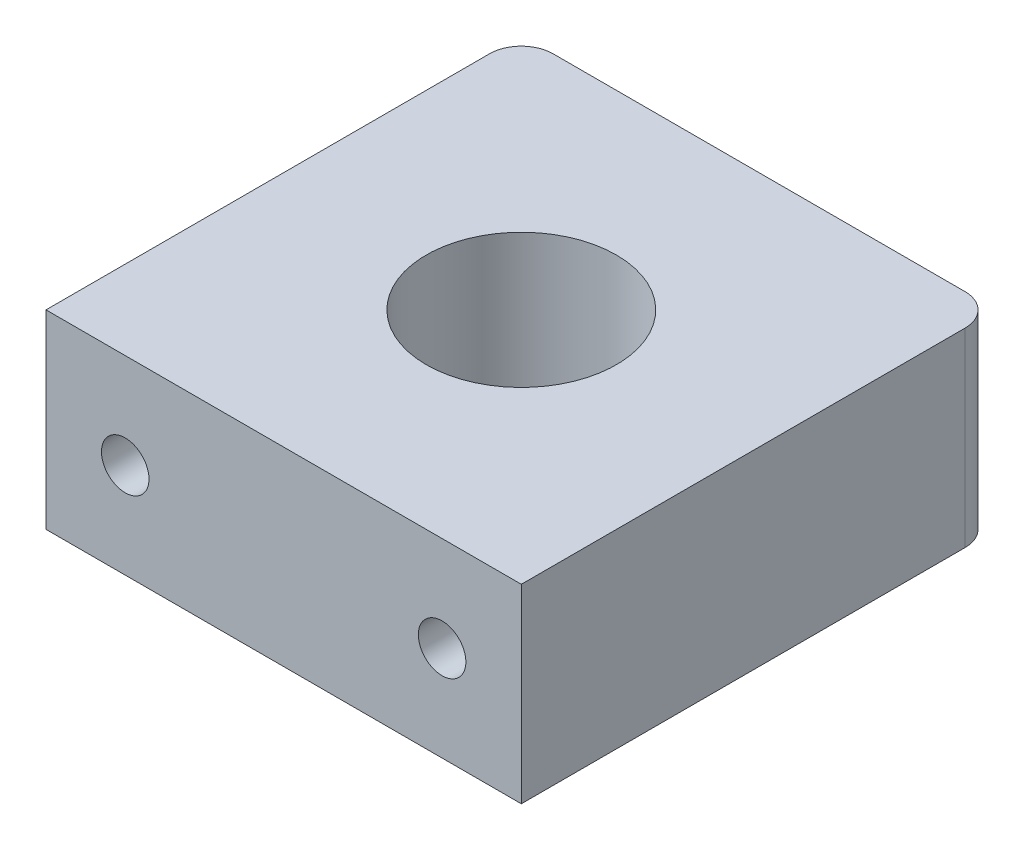
ISO-10303-21;
HEADER;
FILE_DESCRIPTION(('STEP AP214'),'2;1');
FILE_NAME('part.step','',(''),(''),'','','');
FILE_SCHEMA(('AUTOMOTIVE_DESIGN { 1 0 10303 214 1 1 1 1 }'));
ENDSEC;
DATA;
#1=APPLICATION_CONTEXT('core data for automotive mechanical design processes');
#2=APPLICATION_PROTOCOL_DEFINITION('international standard','automotive_design',2000,#1);
#3=PRODUCT_CONTEXT('',#1,'mechanical');
#4=PRODUCT('Part','Part','',(#3));
#5=PRODUCT_RELATED_PRODUCT_CATEGORY('part','',(#4));
#6=PRODUCT_DEFINITION_FORMATION('','',#4);
#7=PRODUCT_DEFINITION_CONTEXT('part definition',#1,'design');
#8=PRODUCT_DEFINITION('design','',#6,#7);
#9=PRODUCT_DEFINITION_SHAPE('','',#8);
#10=(LENGTH_UNIT() NAMED_UNIT(*) SI_UNIT(.MILLI.,.METRE.));
#11=(NAMED_UNIT(*) PLANE_ANGLE_UNIT() SI_UNIT($,.RADIAN.));
#12=(NAMED_UNIT(*) SI_UNIT($,.STERADIAN.) SOLID_ANGLE_UNIT());
#13=UNCERTAINTY_MEASURE_WITH_UNIT(LENGTH_MEASURE(1.E-05),#10,'distance_accuracy_value','');
#14=(GEOMETRIC_REPRESENTATION_CONTEXT(3) GLOBAL_UNCERTAINTY_ASSIGNED_CONTEXT((#13)) GLOBAL_UNIT_ASSIGNED_CONTEXT((#10,
#11,#12)) REPRESENTATION_CONTEXT('',''));
#15=CARTESIAN_POINT('',(0.,0.,0.));
#16=DIRECTION('',(0.,0.,1.));
#17=DIRECTION('',(1.,0.,0.));
#18=AXIS2_PLACEMENT_3D('',#15,#16,#17);
#19=CARTESIAN_POINT('',(0.,12.,0.));
#20=DIRECTION('',(0.,-1.,0.));
#21=DIRECTION('',(0.,0.,-1.));
#22=AXIS2_PLACEMENT_3D('',#19,#20,#21);
#23=PLANE('',#22);
#24=DIRECTION('',(0.,0.,-1.));
#25=VECTOR('',#24,1.);
#26=CARTESIAN_POINT('',(30.,12.,0.));
#27=LINE('',#26,#25);
#28=CARTESIAN_POINT('',(30.,12.,0.));
#29=VERTEX_POINT('',#28);
#30=CARTESIAN_POINT('',(30.,12.,-28.));
#31=VERTEX_POINT('',#30);
#32=EDGE_CURVE('E110',#29,#31,#27,.T.);
#33=ORIENTED_EDGE('',*,*,#32,.T.);
#34=CARTESIAN_POINT('',(28.,12.,-28.));
#35=DIRECTION('',(0.,-1.,0.));
#36=DIRECTION('',(0.,0.,-1.));
#37=AXIS2_PLACEMENT_3D('',#34,#35,#36);
#38=CIRCLE('',#37,2.);
#39=CARTESIAN_POINT('',(28.,12.,-30.));
#40=VERTEX_POINT('',#39);
#41=EDGE_CURVE('E49',#31,#40,#38,.F.);
#42=ORIENTED_EDGE('',*,*,#41,.T.);
#43=DIRECTION('',(-1.,0.,0.));
#44=VECTOR('',#43,1.);
#45=CARTESIAN_POINT('',(0.,12.,-30.));
#46=LINE('',#45,#44);
#47=CARTESIAN_POINT('',(2.,12.,-30.));
#48=VERTEX_POINT('',#47);
#49=EDGE_CURVE('E120',#40,#48,#46,.T.);
#50=ORIENTED_EDGE('',*,*,#49,.T.);
#51=CARTESIAN_POINT('',(2.,12.,-28.));
#52=DIRECTION('',(0.,-1.,0.));
#53=DIRECTION('',(0.,0.,-1.));
#54=AXIS2_PLACEMENT_3D('',#51,#52,#53);
#55=CIRCLE('',#54,2.);
#56=CARTESIAN_POINT('',(0.,12.,-28.));
#57=VERTEX_POINT('',#56);
#58=EDGE_CURVE('E56',#48,#57,#55,.F.);
#59=ORIENTED_EDGE('',*,*,#58,.T.);
#60=DIRECTION('',(0.,0.,1.));
#61=VECTOR('',#60,1.);
#62=CARTESIAN_POINT('',(0.,12.,0.));
#63=LINE('',#62,#61);
#64=CARTESIAN_POINT('',(0.,12.,0.));
#65=VERTEX_POINT('',#64);
#66=EDGE_CURVE('E94',#57,#65,#63,.T.);
#67=ORIENTED_EDGE('',*,*,#66,.T.);
#68=DIRECTION('',(1.,0.,0.));
#69=VECTOR('',#68,1.);
#70=CARTESIAN_POINT('',(0.,12.,0.));
#71=LINE('',#70,#69);
#72=EDGE_CURVE('E97',#65,#29,#71,.T.);
#73=ORIENTED_EDGE('',*,*,#72,.T.);
#74=EDGE_LOOP('',(#33,#42,#50,#59,#67,#73));
#75=FACE_BOUND('',#74,.T.);
#76=CARTESIAN_POINT('',(15.,12.,-15.));
#77=DIRECTION('',(0.,1.,0.));
#78=DIRECTION('',(0.,0.,1.));
#79=AXIS2_PLACEMENT_3D('',#76,#77,#78);
#80=CIRCLE('',#79,6.);
#81=CARTESIAN_POINT('',(15.,12.,-9.));
#82=VERTEX_POINT('',#81);
#83=EDGE_CURVE('E152',#82,#82,#80,.T.);
#84=ORIENTED_EDGE('',*,*,#83,.F.);
#85=EDGE_LOOP('',(#84));
#86=FACE_BOUND('',#85,.T.);
#87=ADVANCED_FACE('F41',(#75,#86),#23,.F.);
#88=CARTESIAN_POINT('',(0.,0.,0.));
#89=DIRECTION('',(0.,-1.,0.));
#90=DIRECTION('',(0.,0.,-1.));
#91=AXIS2_PLACEMENT_3D('',#88,#89,#90);
#92=PLANE('',#91);
#93=DIRECTION('',(-1.,0.,0.));
#94=VECTOR('',#93,1.);
#95=CARTESIAN_POINT('',(0.,0.,-30.));
#96=LINE('',#95,#94);
#97=CARTESIAN_POINT('',(28.,0.,-30.));
#98=VERTEX_POINT('',#97);
#99=CARTESIAN_POINT('',(2.,0.,-30.));
#100=VERTEX_POINT('',#99);
#101=EDGE_CURVE('E102',#98,#100,#96,.T.);
#102=ORIENTED_EDGE('',*,*,#101,.F.);
#103=CARTESIAN_POINT('',(28.,0.,-28.));
#104=DIRECTION('',(0.,-1.,0.));
#105=DIRECTION('',(0.,0.,-1.));
#106=AXIS2_PLACEMENT_3D('',#103,#104,#105);
#107=CIRCLE('',#106,2.);
#108=CARTESIAN_POINT('',(30.,0.,-28.));
#109=VERTEX_POINT('',#108);
#110=EDGE_CURVE('E128',#98,#109,#107,.T.);
#111=ORIENTED_EDGE('',*,*,#110,.T.);
#112=DIRECTION('',(0.,0.,-1.));
#113=VECTOR('',#112,1.);
#114=CARTESIAN_POINT('',(30.,0.,0.));
#115=LINE('',#114,#113);
#116=CARTESIAN_POINT('',(30.,0.,0.));
#117=VERTEX_POINT('',#116);
#118=EDGE_CURVE('E146',#117,#109,#115,.T.);
#119=ORIENTED_EDGE('',*,*,#118,.F.);
#120=DIRECTION('',(1.,0.,0.));
#121=VECTOR('',#120,1.);
#122=CARTESIAN_POINT('',(0.,0.,0.));
#123=LINE('',#122,#121);
#124=CARTESIAN_POINT('',(0.,0.,0.));
#125=VERTEX_POINT('',#124);
#126=EDGE_CURVE('E148',#125,#117,#123,.T.);
#127=ORIENTED_EDGE('',*,*,#126,.F.);
#128=DIRECTION('',(0.,0.,1.));
#129=VECTOR('',#128,1.);
#130=CARTESIAN_POINT('',(0.,0.,0.));
#131=LINE('',#130,#129);
#132=CARTESIAN_POINT('',(0.,0.,-28.));
#133=VERTEX_POINT('',#132);
#134=EDGE_CURVE('E114',#133,#125,#131,.T.);
#135=ORIENTED_EDGE('',*,*,#134,.F.);
#136=CARTESIAN_POINT('',(2.,0.,-28.));
#137=DIRECTION('',(0.,-1.,0.));
#138=DIRECTION('',(0.,0.,-1.));
#139=AXIS2_PLACEMENT_3D('',#136,#137,#138);
#140=CIRCLE('',#139,2.);
#141=EDGE_CURVE('E126',#133,#100,#140,.T.);
#142=ORIENTED_EDGE('',*,*,#141,.T.);
#143=EDGE_LOOP('',(#102,#111,#119,#127,#135,#142));
#144=FACE_BOUND('',#143,.T.);
#145=CARTESIAN_POINT('',(15.,0.,-15.));
#146=DIRECTION('',(0.,1.,0.));
#147=DIRECTION('',(0.,0.,1.));
#148=AXIS2_PLACEMENT_3D('',#145,#146,#147);
#149=CIRCLE('',#148,6.);
#150=CARTESIAN_POINT('',(15.,0.,-9.));
#151=VERTEX_POINT('',#150);
#152=EDGE_CURVE('E156',#151,#151,#149,.T.);
#153=ORIENTED_EDGE('',*,*,#152,.T.);
#154=EDGE_LOOP('',(#153));
#155=FACE_BOUND('',#154,.T.);
#156=ADVANCED_FACE('F144',(#144,#155),#92,.T.);
#157=CARTESIAN_POINT('',(0.,12.,0.));
#158=DIRECTION('',(1.,0.,0.));
#159=DIRECTION('',(0.,0.,-1.));
#160=AXIS2_PLACEMENT_3D('',#157,#158,#159);
#161=PLANE('',#160);
#162=ORIENTED_EDGE('',*,*,#66,.F.);
#163=DIRECTION('',(0.,-1.,0.));
#164=VECTOR('',#163,1.);
#165=CARTESIAN_POINT('',(0.,12.,-28.));
#166=LINE('',#165,#164);
#167=EDGE_CURVE('E12',#57,#133,#166,.T.);
#168=ORIENTED_EDGE('',*,*,#167,.T.);
#169=ORIENTED_EDGE('',*,*,#134,.T.);
#170=DIRECTION('',(0.,-1.,0.));
#171=VECTOR('',#170,1.);
#172=CARTESIAN_POINT('',(0.,12.,0.));
#173=LINE('',#172,#171);
#174=EDGE_CURVE('E107',#65,#125,#173,.T.);
#175=ORIENTED_EDGE('',*,*,#174,.F.);
#176=EDGE_LOOP('',(#162,#168,#169,#175));
#177=FACE_BOUND('',#176,.T.);
#178=ADVANCED_FACE('F112',(#177),#161,.F.);
#179=CARTESIAN_POINT('',(0.,12.,0.));
#180=DIRECTION('',(0.,0.,-1.));
#181=DIRECTION('',(-1.,0.,0.));
#182=AXIS2_PLACEMENT_3D('',#179,#180,#181);
#183=PLANE('',#182);
#184=CARTESIAN_POINT('',(25.,6.,0.));
#185=DIRECTION('',(0.,0.,1.));
#186=DIRECTION('',(-1.,0.,0.));
#187=AXIS2_PLACEMENT_3D('',#184,#185,#186);
#188=CIRCLE('',#187,1.5);
#189=CARTESIAN_POINT('',(23.5,6.,0.));
#190=VERTEX_POINT('',#189);
#191=EDGE_CURVE('E169',#190,#190,#188,.T.);
#192=ORIENTED_EDGE('',*,*,#191,.F.);
#193=EDGE_LOOP('',(#192));
#194=FACE_BOUND('',#193,.T.);
#195=CARTESIAN_POINT('',(5.,6.,0.));
#196=DIRECTION('',(0.,0.,1.));
#197=DIRECTION('',(1.,0.,0.));
#198=AXIS2_PLACEMENT_3D('',#195,#196,#197);
#199=CIRCLE('',#198,1.5);
#200=CARTESIAN_POINT('',(6.5,6.,0.));
#201=VERTEX_POINT('',#200);
#202=EDGE_CURVE('E163',#201,#201,#199,.T.);
#203=ORIENTED_EDGE('',*,*,#202,.F.);
#204=EDGE_LOOP('',(#203));
#205=FACE_BOUND('',#204,.T.);
#206=ORIENTED_EDGE('',*,*,#126,.T.);
#207=DIRECTION('',(0.,-1.,0.));
#208=VECTOR('',#207,1.);
#209=CARTESIAN_POINT('',(30.,12.,0.));
#210=LINE('',#209,#208);
#211=EDGE_CURVE('E109',#29,#117,#210,.T.);
#212=ORIENTED_EDGE('',*,*,#211,.F.);
#213=ORIENTED_EDGE('',*,*,#72,.F.);
#214=ORIENTED_EDGE('',*,*,#174,.T.);
#215=EDGE_LOOP('',(#206,#212,#213,#214));
#216=FACE_BOUND('',#215,.T.);
#217=ADVANCED_FACE('F106',(#194,#205,#216),#183,.F.);
#218=CARTESIAN_POINT('',(30.,12.,0.));
#219=DIRECTION('',(-1.,0.,0.));
#220=DIRECTION('',(0.,0.,1.));
#221=AXIS2_PLACEMENT_3D('',#218,#219,#220);
#222=PLANE('',#221);
#223=ORIENTED_EDGE('',*,*,#118,.T.);
#224=DIRECTION('',(0.,-1.,0.));
#225=VECTOR('',#224,1.);
#226=CARTESIAN_POINT('',(30.,12.,-28.));
#227=LINE('',#226,#225);
#228=EDGE_CURVE('E64',#109,#31,#227,.F.);
#229=ORIENTED_EDGE('',*,*,#228,.T.);
#230=ORIENTED_EDGE('',*,*,#32,.F.);
#231=ORIENTED_EDGE('',*,*,#211,.T.);
#232=EDGE_LOOP('',(#223,#229,#230,#231));
#233=FACE_BOUND('',#232,.T.);
#234=ADVANCED_FACE('F147',(#233),#222,.F.);
#235=CARTESIAN_POINT('',(0.,12.,-30.));
#236=DIRECTION('',(0.,0.,1.));
#237=DIRECTION('',(1.,0.,0.));
#238=AXIS2_PLACEMENT_3D('',#235,#236,#237);
#239=PLANE('',#238);
#240=ORIENTED_EDGE('',*,*,#49,.F.);
#241=DIRECTION('',(0.,-1.,0.));
#242=VECTOR('',#241,1.);
#243=CARTESIAN_POINT('',(28.,12.,-30.));
#244=LINE('',#243,#242);
#245=EDGE_CURVE('E118',#40,#98,#244,.T.);
#246=ORIENTED_EDGE('',*,*,#245,.T.);
#247=ORIENTED_EDGE('',*,*,#101,.T.);
#248=DIRECTION('',(0.,-1.,0.));
#249=VECTOR('',#248,1.);
#250=CARTESIAN_POINT('',(2.,12.,-30.));
#251=LINE('',#250,#249);
#252=EDGE_CURVE('E116',#100,#48,#251,.F.);
#253=ORIENTED_EDGE('',*,*,#252,.T.);
#254=EDGE_LOOP('',(#240,#246,#247,#253));
#255=FACE_BOUND('',#254,.T.);
#256=ADVANCED_FACE('F136',(#255),#239,.F.);
#257=CARTESIAN_POINT('',(15.,12.,-15.));
#258=DIRECTION('',(0.,-1.,0.));
#259=DIRECTION('',(0.,0.,-1.));
#260=AXIS2_PLACEMENT_3D('',#257,#258,#259);
#261=CYLINDRICAL_SURFACE('',#260,6.);
#262=ORIENTED_EDGE('',*,*,#83,.T.);
#263=EDGE_LOOP('',(#262));
#264=FACE_BOUND('',#263,.T.);
#265=ORIENTED_EDGE('',*,*,#152,.F.);
#266=EDGE_LOOP('',(#265));
#267=FACE_BOUND('',#266,.T.);
#268=ADVANCED_FACE('F208',(#264,#267),#261,.F.);
#269=CARTESIAN_POINT('',(28.,12.,-28.));
#270=DIRECTION('',(0.,-1.,0.));
#271=DIRECTION('',(0.,0.,-1.));
#272=AXIS2_PLACEMENT_3D('',#269,#270,#271);
#273=CYLINDRICAL_SURFACE('',#272,2.);
#274=ORIENTED_EDGE('',*,*,#41,.F.);
#275=ORIENTED_EDGE('',*,*,#228,.F.);
#276=ORIENTED_EDGE('',*,*,#110,.F.);
#277=ORIENTED_EDGE('',*,*,#245,.F.);
#278=EDGE_LOOP('',(#274,#275,#276,#277));
#279=FACE_BOUND('',#278,.T.);
#280=ADVANCED_FACE('F141',(#279),#273,.T.);
#281=CARTESIAN_POINT('',(2.,12.,-28.));
#282=DIRECTION('',(0.,-1.,0.));
#283=DIRECTION('',(0.,0.,-1.));
#284=AXIS2_PLACEMENT_3D('',#281,#282,#283);
#285=CYLINDRICAL_SURFACE('',#284,2.);
#286=ORIENTED_EDGE('',*,*,#58,.F.);
#287=ORIENTED_EDGE('',*,*,#252,.F.);
#288=ORIENTED_EDGE('',*,*,#141,.F.);
#289=ORIENTED_EDGE('',*,*,#167,.F.);
#290=EDGE_LOOP('',(#286,#287,#288,#289));
#291=FACE_BOUND('',#290,.T.);
#292=ADVANCED_FACE('F43',(#291),#285,.T.);
#293=CARTESIAN_POINT('',(5.,6.,-5.));
#294=DIRECTION('',(0.,0.,1.));
#295=DIRECTION('',(1.,0.,0.));
#296=AXIS2_PLACEMENT_3D('',#293,#294,#295);
#297=CYLINDRICAL_SURFACE('',#296,1.5);
#298=CARTESIAN_POINT('',(5.,6.,-5.));
#299=DIRECTION('',(0.,0.,1.));
#300=DIRECTION('',(1.,0.,0.));
#301=AXIS2_PLACEMENT_3D('',#298,#299,#300);
#302=CIRCLE('',#301,1.5);
#303=CARTESIAN_POINT('',(6.5,6.,-5.));
#304=VERTEX_POINT('',#303);
#305=EDGE_CURVE('E158',#304,#304,#302,.T.);
#306=ORIENTED_EDGE('',*,*,#305,.F.);
#307=EDGE_LOOP('',(#306));
#308=FACE_BOUND('',#307,.T.);
#309=ORIENTED_EDGE('',*,*,#202,.T.);
#310=EDGE_LOOP('',(#309));
#311=FACE_BOUND('',#310,.T.);
#312=ADVANCED_FACE('F189',(#308,#311),#297,.F.);
#313=CARTESIAN_POINT('',(5.,6.,-5.));
#314=DIRECTION('',(0.,0.,1.));
#315=DIRECTION('',(1.,0.,0.));
#316=AXIS2_PLACEMENT_3D('',#313,#314,#315);
#317=PLANE('',#316);
#318=ORIENTED_EDGE('',*,*,#305,.T.);
#319=EDGE_LOOP('',(#318));
#320=FACE_BOUND('',#319,.T.);
#321=ADVANCED_FACE('F180',(#320),#317,.T.);
#322=CARTESIAN_POINT('',(25.,6.,-5.));
#323=DIRECTION('',(0.,0.,1.));
#324=DIRECTION('',(1.,0.,0.));
#325=AXIS2_PLACEMENT_3D('',#322,#323,#324);
#326=CYLINDRICAL_SURFACE('',#325,1.5);
#327=CARTESIAN_POINT('',(25.,6.,-5.));
#328=DIRECTION('',(0.,0.,1.));
#329=DIRECTION('',(-1.,0.,0.));
#330=AXIS2_PLACEMENT_3D('',#327,#328,#329);
#331=CIRCLE('',#330,1.5);
#332=CARTESIAN_POINT('',(23.5,6.,-5.));
#333=VERTEX_POINT('',#332);
#334=EDGE_CURVE('E166',#333,#333,#331,.T.);
#335=ORIENTED_EDGE('',*,*,#334,.F.);
#336=EDGE_LOOP('',(#335));
#337=FACE_BOUND('',#336,.T.);
#338=ORIENTED_EDGE('',*,*,#191,.T.);
#339=EDGE_LOOP('',(#338));
#340=FACE_BOUND('',#339,.T.);
#341=ADVANCED_FACE('F177',(#337,#340),#326,.F.);
#342=CARTESIAN_POINT('',(25.,6.,-5.));
#343=DIRECTION('',(0.,0.,-1.));
#344=DIRECTION('',(-1.,0.,0.));
#345=AXIS2_PLACEMENT_3D('',#342,#343,#344);
#346=PLANE('',#345);
#347=ORIENTED_EDGE('',*,*,#334,.T.);
#348=EDGE_LOOP('',(#347));
#349=FACE_BOUND('',#348,.T.);
#350=ADVANCED_FACE('F175',(#349),#346,.F.);
#351=CLOSED_SHELL('',(#87,#156,#178,#217,#234,#256,#268,#280,#292,#312,#321,#341,#350));
#352=MANIFOLD_SOLID_BREP('B2',#351);
#353=ADVANCED_BREP_SHAPE_REPRESENTATION('',(#18,#352),#14);
#354=SHAPE_DEFINITION_REPRESENTATION(#9,#353);
ENDSEC;
END-ISO-10303-21;
